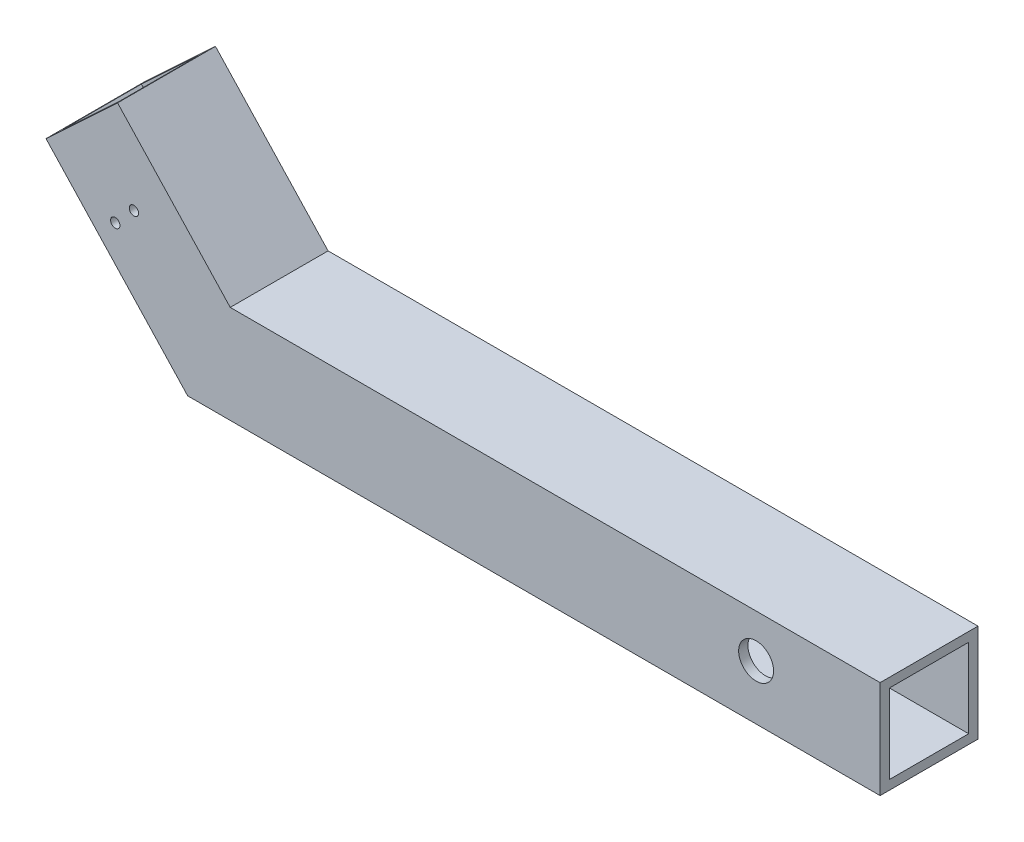
ISO-10303-21;
HEADER;
FILE_DESCRIPTION(('STEP AP214'),'2;1');
FILE_NAME('part.step','',(''),(''),'','','');
FILE_SCHEMA(('AUTOMOTIVE_DESIGN { 1 0 10303 214 1 1 1 1 }'));
ENDSEC;
DATA;
#1=APPLICATION_CONTEXT('core data for automotive mechanical design processes');
#2=APPLICATION_PROTOCOL_DEFINITION('international standard','automotive_design',2000,#1);
#3=PRODUCT_CONTEXT('',#1,'mechanical');
#4=PRODUCT('Part','Part','',(#3));
#5=PRODUCT_RELATED_PRODUCT_CATEGORY('part','',(#4));
#6=PRODUCT_DEFINITION_FORMATION('','',#4);
#7=PRODUCT_DEFINITION_CONTEXT('part definition',#1,'design');
#8=PRODUCT_DEFINITION('design','',#6,#7);
#9=PRODUCT_DEFINITION_SHAPE('','',#8);
#10=(LENGTH_UNIT() NAMED_UNIT(*) SI_UNIT(.MILLI.,.METRE.));
#11=(NAMED_UNIT(*) PLANE_ANGLE_UNIT() SI_UNIT($,.RADIAN.));
#12=(NAMED_UNIT(*) SI_UNIT($,.STERADIAN.) SOLID_ANGLE_UNIT());
#13=UNCERTAINTY_MEASURE_WITH_UNIT(LENGTH_MEASURE(1.E-05),#10,'distance_accuracy_value','');
#14=(GEOMETRIC_REPRESENTATION_CONTEXT(3) GLOBAL_UNCERTAINTY_ASSIGNED_CONTEXT((#13)) GLOBAL_UNIT_ASSIGNED_CONTEXT((#10,
#11,#12)) REPRESENTATION_CONTEXT('',''));
#15=CARTESIAN_POINT('',(0.,0.,0.));
#16=DIRECTION('',(0.,0.,1.));
#17=DIRECTION('',(1.,0.,0.));
#18=AXIS2_PLACEMENT_3D('',#15,#16,#17);
#19=CARTESIAN_POINT('',(-178.186200412297,10.795,10.795));
#20=DIRECTION('',(0.731353701619171,0.681998360062497,0.));
#21=DIRECTION('',(-0.681998360062497,0.731353701619172,0.));
#22=AXIS2_PLACEMENT_3D('',#19,#20,#21);
#23=PLANE('',#22);
#24=DIRECTION('',(-0.681998360062497,0.731353701619171,0.));
#25=VECTOR('',#24,1.);
#26=CARTESIAN_POINT('',(-178.186200412297,10.795,10.795));
#27=LINE('',#26,#25);
#28=CARTESIAN_POINT('',(-178.186200412297,10.795,10.795));
#29=VERTEX_POINT('',#28);
#30=CARTESIAN_POINT('',(-209.630553482196,44.5149403391286,10.795));
#31=VERTEX_POINT('',#30);
#32=EDGE_CURVE('E49',#29,#31,#27,.T.);
#33=ORIENTED_EDGE('',*,*,#32,.T.);
#34=DIRECTION('',(0.,0.,1.));
#35=VECTOR('',#34,1.);
#36=CARTESIAN_POINT('',(-209.630553482196,44.5149403391286,10.795));
#37=LINE('',#36,#35);
#38=CARTESIAN_POINT('',(-209.630553482196,44.5149403391286,-10.795));
#39=VERTEX_POINT('',#38);
#40=EDGE_CURVE('E215',#39,#31,#37,.T.);
#41=ORIENTED_EDGE('',*,*,#40,.F.);
#42=DIRECTION('',(-0.681998360062497,0.731353701619171,0.));
#43=VECTOR('',#42,1.);
#44=CARTESIAN_POINT('',(-178.186200412297,10.795,-10.795));
#45=LINE('',#44,#43);
#46=CARTESIAN_POINT('',(-178.186200412297,10.795,-10.795));
#47=VERTEX_POINT('',#46);
#48=EDGE_CURVE('E190',#47,#39,#45,.T.);
#49=ORIENTED_EDGE('',*,*,#48,.F.);
#50=DIRECTION('',(0.,0.,-1.));
#51=VECTOR('',#50,1.);
#52=CARTESIAN_POINT('',(-178.186200412297,10.795,10.795));
#53=LINE('',#52,#51);
#54=EDGE_CURVE('E173',#29,#47,#53,.T.);
#55=ORIENTED_EDGE('',*,*,#54,.F.);
#56=EDGE_LOOP('',(#33,#41,#49,#55));
#57=FACE_BOUND('',#56,.T.);
#58=ADVANCED_FACE('F34',(#57),#23,.F.);
#59=CARTESIAN_POINT('',(-187.573799587703,-10.795,10.795));
#60=DIRECTION('',(-0.731353701619171,-0.681998360062497,0.));
#61=DIRECTION('',(0.681998360062497,-0.731353701619172,0.));
#62=AXIS2_PLACEMENT_3D('',#59,#60,#61);
#63=PLANE('',#62);
#64=DIRECTION('',(-0.681998360062497,0.731353701619171,0.));
#65=VECTOR('',#64,1.);
#66=CARTESIAN_POINT('',(-187.573799587703,-10.795,-10.795));
#67=LINE('',#66,#65);
#68=CARTESIAN_POINT('',(-187.573799587703,-10.795,-10.795));
#69=VERTEX_POINT('',#68);
#70=CARTESIAN_POINT('',(-225.420479900154,29.7905957453792,-10.795));
#71=VERTEX_POINT('',#70);
#72=EDGE_CURVE('E192',#69,#71,#67,.T.);
#73=ORIENTED_EDGE('',*,*,#72,.T.);
#74=DIRECTION('',(0.,0.,-1.));
#75=VECTOR('',#74,1.);
#76=CARTESIAN_POINT('',(-225.420479900154,29.7905957453792,10.795));
#77=LINE('',#76,#75);
#78=CARTESIAN_POINT('',(-225.420479900154,29.7905957453792,10.795));
#79=VERTEX_POINT('',#78);
#80=EDGE_CURVE('E42',#79,#71,#77,.T.);
#81=ORIENTED_EDGE('',*,*,#80,.F.);
#82=DIRECTION('',(-0.681998360062497,0.731353701619171,0.));
#83=VECTOR('',#82,1.);
#84=CARTESIAN_POINT('',(-187.573799587703,-10.795,10.795));
#85=LINE('',#84,#83);
#86=CARTESIAN_POINT('',(-187.573799587703,-10.795,10.795));
#87=VERTEX_POINT('',#86);
#88=EDGE_CURVE('E56',#87,#79,#85,.T.);
#89=ORIENTED_EDGE('',*,*,#88,.F.);
#90=DIRECTION('',(0.,0.,1.));
#91=VECTOR('',#90,1.);
#92=CARTESIAN_POINT('',(-187.573799587703,-10.795,10.795));
#93=LINE('',#92,#91);
#94=EDGE_CURVE('E229',#69,#87,#93,.T.);
#95=ORIENTED_EDGE('',*,*,#94,.F.);
#96=EDGE_LOOP('',(#73,#81,#89,#95));
#97=FACE_BOUND('',#96,.T.);
#98=ADVANCED_FACE('F225',(#97),#63,.F.);
#99=CARTESIAN_POINT('',(-188.678223020104,-13.335,13.335));
#100=DIRECTION('',(-0.731353701619171,-0.681998360062497,0.));
#101=DIRECTION('',(0.681998360062497,-0.731353701619172,0.));
#102=AXIS2_PLACEMENT_3D('',#99,#100,#101);
#103=PLANE('',#102);
#104=DIRECTION('',(-0.681998360062497,0.731353701619171,0.));
#105=VECTOR('',#104,1.);
#106=CARTESIAN_POINT('',(-188.678223020104,-13.335,13.335));
#107=LINE('',#106,#105);
#108=CARTESIAN_POINT('',(-188.678223020104,-13.335,13.335));
#109=VERTEX_POINT('',#108);
#110=CARTESIAN_POINT('',(-227.278118302266,28.0583199108205,13.335));
#111=VERTEX_POINT('',#110);
#112=EDGE_CURVE('E132',#109,#111,#107,.T.);
#113=ORIENTED_EDGE('',*,*,#112,.T.);
#114=DIRECTION('',(0.,0.,-1.));
#115=VECTOR('',#114,1.);
#116=CARTESIAN_POINT('',(-227.278118302266,28.0583199108205,13.335));
#117=LINE('',#116,#115);
#118=CARTESIAN_POINT('',(-227.278118302266,28.0583199108205,-13.335));
#119=VERTEX_POINT('',#118);
#120=EDGE_CURVE('E209',#111,#119,#117,.T.);
#121=ORIENTED_EDGE('',*,*,#120,.T.);
#122=DIRECTION('',(-0.681998360062497,0.731353701619171,0.));
#123=VECTOR('',#122,1.);
#124=CARTESIAN_POINT('',(-188.678223020104,-13.335,-13.335));
#125=LINE('',#124,#123);
#126=CARTESIAN_POINT('',(-188.678223020104,-13.335,-13.335));
#127=VERTEX_POINT('',#126);
#128=EDGE_CURVE('E198',#127,#119,#125,.T.);
#129=ORIENTED_EDGE('',*,*,#128,.F.);
#130=DIRECTION('',(0.,0.,1.));
#131=VECTOR('',#130,1.);
#132=CARTESIAN_POINT('',(-188.678223020104,-13.335,13.335));
#133=LINE('',#132,#131);
#134=EDGE_CURVE('E157',#127,#109,#133,.T.);
#135=ORIENTED_EDGE('',*,*,#134,.T.);
#136=EDGE_LOOP('',(#113,#121,#129,#135));
#137=FACE_BOUND('',#136,.T.);
#138=ADVANCED_FACE('F238',(#137),#103,.T.);
#139=CARTESIAN_POINT('',(-177.081776979896,13.335,13.335));
#140=DIRECTION('',(0.731353701619171,0.681998360062497,0.));
#141=DIRECTION('',(-0.681998360062497,0.731353701619172,0.));
#142=AXIS2_PLACEMENT_3D('',#139,#140,#141);
#143=PLANE('',#142);
#144=DIRECTION('',(-0.681998360062497,0.731353701619171,0.));
#145=VECTOR('',#144,1.);
#146=CARTESIAN_POINT('',(-177.081776979896,13.335,-13.335));
#147=LINE('',#146,#145);
#148=CARTESIAN_POINT('',(-177.081776979896,13.335,-13.335));
#149=VERTEX_POINT('',#148);
#150=CARTESIAN_POINT('',(-207.772915080083,46.2472161736873,-13.335));
#151=VERTEX_POINT('',#150);
#152=EDGE_CURVE('E200',#149,#151,#147,.T.);
#153=ORIENTED_EDGE('',*,*,#152,.T.);
#154=DIRECTION('',(0.,0.,1.));
#155=VECTOR('',#154,1.);
#156=CARTESIAN_POINT('',(-207.772915080083,46.2472161736873,13.335));
#157=LINE('',#156,#155);
#158=CARTESIAN_POINT('',(-207.772915080083,46.2472161736873,13.335));
#159=VERTEX_POINT('',#158);
#160=EDGE_CURVE('E204',#151,#159,#157,.T.);
#161=ORIENTED_EDGE('',*,*,#160,.T.);
#162=DIRECTION('',(-0.681998360062497,0.731353701619171,0.));
#163=VECTOR('',#162,1.);
#164=CARTESIAN_POINT('',(-177.081776979896,13.335,13.335));
#165=LINE('',#164,#163);
#166=CARTESIAN_POINT('',(-177.081776979896,13.335,13.335));
#167=VERTEX_POINT('',#166);
#168=EDGE_CURVE('E202',#167,#159,#165,.T.);
#169=ORIENTED_EDGE('',*,*,#168,.F.);
#170=DIRECTION('',(0.,0.,-1.));
#171=VECTOR('',#170,1.);
#172=CARTESIAN_POINT('',(-177.081776979896,13.335,13.335));
#173=LINE('',#172,#171);
#174=EDGE_CURVE('E193',#167,#149,#173,.T.);
#175=ORIENTED_EDGE('',*,*,#174,.T.);
#176=EDGE_LOOP('',(#153,#161,#169,#175));
#177=FACE_BOUND('',#176,.T.);
#178=ADVANCED_FACE('F36',(#177),#143,.T.);
#179=CARTESIAN_POINT('',(-171.835765675992,-10.795,-10.795));
#180=DIRECTION('',(0.,0.,-1.));
#181=DIRECTION('',(-1.,0.,0.));
#182=AXIS2_PLACEMENT_3D('',#179,#180,#181);
#183=PLANE('',#182);
#184=CARTESIAN_POINT('',(-208.411861608204,17.6283866894344,-10.795));
#185=DIRECTION('',(0.,0.,-1.));
#186=DIRECTION('',(-1.,0.,0.));
#187=AXIS2_PLACEMENT_3D('',#184,#185,#186);
#188=CIRCLE('',#187,1.26999999999998);
#189=CARTESIAN_POINT('',(-209.681861608204,17.6283866894344,-10.795));
#190=VERTEX_POINT('',#189);
#191=EDGE_CURVE('E280',#190,#190,#188,.T.);
#192=ORIENTED_EDGE('',*,*,#191,.T.);
#193=EDGE_LOOP('',(#192));
#194=FACE_BOUND('',#193,.T.);
#195=CARTESIAN_POINT('',(-203.326149513576,23.0386003588108,-10.795));
#196=DIRECTION('',(0.,0.,-1.));
#197=DIRECTION('',(-1.,0.,0.));
#198=AXIS2_PLACEMENT_3D('',#195,#196,#197);
#199=CIRCLE('',#198,1.27);
#200=CARTESIAN_POINT('',(-204.596149513576,23.0386003588108,-10.795));
#201=VERTEX_POINT('',#200);
#202=EDGE_CURVE('E268',#201,#201,#199,.T.);
#203=ORIENTED_EDGE('',*,*,#202,.T.);
#204=EDGE_LOOP('',(#203));
#205=FACE_BOUND('',#204,.T.);
#206=CARTESIAN_POINT('',(-33.7886153722871,1.55344016562079,-10.795));
#207=DIRECTION('',(0.,0.,-1.));
#208=DIRECTION('',(-1.,0.,0.));
#209=AXIS2_PLACEMENT_3D('',#206,#207,#208);
#210=CIRCLE('',#209,4.7625);
#211=CARTESIAN_POINT('',(-38.5511153722871,1.55344016562079,-10.795));
#212=VERTEX_POINT('',#211);
#213=EDGE_CURVE('E151',#212,#212,#210,.T.);
#214=ORIENTED_EDGE('',*,*,#213,.T.);
#215=EDGE_LOOP('',(#214));
#216=FACE_BOUND('',#215,.T.);
#217=DIRECTION('',(0.,1.,0.));
#218=VECTOR('',#217,1.);
#219=CARTESIAN_POINT('',(0.,-10.795,-10.795));
#220=LINE('',#219,#218);
#221=CARTESIAN_POINT('',(0.,-10.795,-10.795));
#222=VERTEX_POINT('',#221);
#223=CARTESIAN_POINT('',(0.,10.795,-10.795));
#224=VERTEX_POINT('',#223);
#225=EDGE_CURVE('E162',#222,#224,#220,.T.);
#226=ORIENTED_EDGE('',*,*,#225,.T.);
#227=DIRECTION('',(1.,0.,0.));
#228=VECTOR('',#227,1.);
#229=CARTESIAN_POINT('',(-171.835765675992,10.795,-10.795));
#230=LINE('',#229,#228);
#231=EDGE_CURVE('E170',#47,#224,#230,.T.);
#232=ORIENTED_EDGE('',*,*,#231,.F.);
#233=ORIENTED_EDGE('',*,*,#48,.T.);
#234=DIRECTION('',(0.731353701619172,0.681998360062497,0.));
#235=VECTOR('',#234,1.);
#236=CARTESIAN_POINT('',(-221.211513984889,33.7155199584025,-10.795));
#237=LINE('',#236,#235);
#238=EDGE_CURVE('E218',#71,#39,#237,.T.);
#239=ORIENTED_EDGE('',*,*,#238,.F.);
#240=ORIENTED_EDGE('',*,*,#72,.F.);
#241=DIRECTION('',(1.,0.,0.));
#242=VECTOR('',#241,1.);
#243=CARTESIAN_POINT('',(-171.835765675992,-10.795,-10.795));
#244=LINE('',#243,#242);
#245=EDGE_CURVE('E180',#69,#222,#244,.T.);
#246=ORIENTED_EDGE('',*,*,#245,.T.);
#247=EDGE_LOOP('',(#226,#232,#233,#239,#240,#246));
#248=FACE_BOUND('',#247,.T.);
#249=ADVANCED_FACE('F231',(#194,#205,#216,#248),#183,.F.);
#250=CARTESIAN_POINT('',(-171.835765675992,10.795,10.795));
#251=DIRECTION('',(0.,1.,0.));
#252=DIRECTION('',(-1.,0.,0.));
#253=AXIS2_PLACEMENT_3D('',#250,#251,#252);
#254=PLANE('',#253);
#255=DIRECTION('',(0.,0.,1.));
#256=VECTOR('',#255,1.);
#257=CARTESIAN_POINT('',(0.,10.795,10.795));
#258=LINE('',#257,#256);
#259=CARTESIAN_POINT('',(0.,10.795,10.795));
#260=VERTEX_POINT('',#259);
#261=EDGE_CURVE('E137',#224,#260,#258,.T.);
#262=ORIENTED_EDGE('',*,*,#261,.T.);
#263=DIRECTION('',(1.,0.,0.));
#264=VECTOR('',#263,1.);
#265=CARTESIAN_POINT('',(-171.835765675992,10.795,10.795));
#266=LINE('',#265,#264);
#267=EDGE_CURVE('E174',#29,#260,#266,.T.);
#268=ORIENTED_EDGE('',*,*,#267,.F.);
#269=ORIENTED_EDGE('',*,*,#54,.T.);
#270=ORIENTED_EDGE('',*,*,#231,.T.);
#271=EDGE_LOOP('',(#262,#268,#269,#270));
#272=FACE_BOUND('',#271,.T.);
#273=ADVANCED_FACE('F307',(#272),#254,.F.);
#274=CARTESIAN_POINT('',(-171.835765675992,-10.795,10.795));
#275=DIRECTION('',(0.,0.,1.));
#276=DIRECTION('',(1.,0.,0.));
#277=AXIS2_PLACEMENT_3D('',#274,#275,#276);
#278=PLANE('',#277);
#279=CARTESIAN_POINT('',(-208.411861608204,17.6283866894344,10.795));
#280=DIRECTION('',(0.,0.,1.));
#281=DIRECTION('',(1.,0.,0.));
#282=AXIS2_PLACEMENT_3D('',#279,#280,#281);
#283=CIRCLE('',#282,1.26999999999998);
#284=CARTESIAN_POINT('',(-207.141861608204,17.6283866894344,10.795));
#285=VERTEX_POINT('',#284);
#286=EDGE_CURVE('E285',#285,#285,#283,.T.);
#287=ORIENTED_EDGE('',*,*,#286,.T.);
#288=EDGE_LOOP('',(#287));
#289=FACE_BOUND('',#288,.T.);
#290=CARTESIAN_POINT('',(-203.326149513576,23.0386003588108,10.795));
#291=DIRECTION('',(0.,0.,1.));
#292=DIRECTION('',(1.,0.,0.));
#293=AXIS2_PLACEMENT_3D('',#290,#291,#292);
#294=CIRCLE('',#293,1.27);
#295=CARTESIAN_POINT('',(-202.056149513577,23.0386003588108,10.795));
#296=VERTEX_POINT('',#295);
#297=EDGE_CURVE('E273',#296,#296,#294,.T.);
#298=ORIENTED_EDGE('',*,*,#297,.T.);
#299=EDGE_LOOP('',(#298));
#300=FACE_BOUND('',#299,.T.);
#301=CARTESIAN_POINT('',(-33.7886153722871,1.55344016562079,10.795));
#302=DIRECTION('',(0.,0.,1.));
#303=DIRECTION('',(1.,0.,0.));
#304=AXIS2_PLACEMENT_3D('',#301,#302,#303);
#305=CIRCLE('',#304,4.7625);
#306=CARTESIAN_POINT('',(-29.0261153722871,1.55344016562079,10.795));
#307=VERTEX_POINT('',#306);
#308=EDGE_CURVE('E154',#307,#307,#305,.T.);
#309=ORIENTED_EDGE('',*,*,#308,.T.);
#310=EDGE_LOOP('',(#309));
#311=FACE_BOUND('',#310,.T.);
#312=DIRECTION('',(0.,-1.,0.));
#313=VECTOR('',#312,1.);
#314=CARTESIAN_POINT('',(0.,-10.795,10.795));
#315=LINE('',#314,#313);
#316=CARTESIAN_POINT('',(0.,-10.795,10.795));
#317=VERTEX_POINT('',#316);
#318=EDGE_CURVE('E167',#260,#317,#315,.T.);
#319=ORIENTED_EDGE('',*,*,#318,.T.);
#320=DIRECTION('',(1.,0.,0.));
#321=VECTOR('',#320,1.);
#322=CARTESIAN_POINT('',(-171.835765675992,-10.795,10.795));
#323=LINE('',#322,#321);
#324=EDGE_CURVE('E177',#87,#317,#323,.T.);
#325=ORIENTED_EDGE('',*,*,#324,.F.);
#326=ORIENTED_EDGE('',*,*,#88,.T.);
#327=DIRECTION('',(-0.731353701619172,-0.681998360062497,0.));
#328=VECTOR('',#327,1.);
#329=CARTESIAN_POINT('',(-221.211513984889,33.7155199584025,10.795));
#330=LINE('',#329,#328);
#331=EDGE_CURVE('E12',#31,#79,#330,.T.);
#332=ORIENTED_EDGE('',*,*,#331,.F.);
#333=ORIENTED_EDGE('',*,*,#32,.F.);
#334=ORIENTED_EDGE('',*,*,#267,.T.);
#335=EDGE_LOOP('',(#319,#325,#326,#332,#333,#334));
#336=FACE_BOUND('',#335,.T.);
#337=ADVANCED_FACE('F333',(#289,#300,#311,#336),#278,.F.);
#338=CARTESIAN_POINT('',(-171.835765675992,-13.335,13.335));
#339=DIRECTION('',(0.,0.,1.));
#340=DIRECTION('',(1.,0.,0.));
#341=AXIS2_PLACEMENT_3D('',#338,#339,#340);
#342=PLANE('',#341);
#343=CARTESIAN_POINT('',(-208.411861608204,17.6283866894344,13.335));
#344=DIRECTION('',(0.,0.,1.));
#345=DIRECTION('',(1.,0.,0.));
#346=AXIS2_PLACEMENT_3D('',#343,#344,#345);
#347=CIRCLE('',#346,1.26999999999998);
#348=CARTESIAN_POINT('',(-207.141861608204,17.6283866894344,13.335));
#349=VERTEX_POINT('',#348);
#350=EDGE_CURVE('E289',#349,#349,#347,.T.);
#351=ORIENTED_EDGE('',*,*,#350,.F.);
#352=EDGE_LOOP('',(#351));
#353=FACE_BOUND('',#352,.T.);
#354=CARTESIAN_POINT('',(-203.326149513576,23.0386003588108,13.335));
#355=DIRECTION('',(0.,0.,1.));
#356=DIRECTION('',(1.,0.,0.));
#357=AXIS2_PLACEMENT_3D('',#354,#355,#356);
#358=CIRCLE('',#357,1.27);
#359=CARTESIAN_POINT('',(-202.056149513577,23.0386003588108,13.335));
#360=VERTEX_POINT('',#359);
#361=EDGE_CURVE('E277',#360,#360,#358,.T.);
#362=ORIENTED_EDGE('',*,*,#361,.F.);
#363=EDGE_LOOP('',(#362));
#364=FACE_BOUND('',#363,.T.);
#365=CARTESIAN_POINT('',(-33.7886153722871,1.55344016562079,13.335));
#366=DIRECTION('',(0.,0.,1.));
#367=DIRECTION('',(1.,0.,0.));
#368=AXIS2_PLACEMENT_3D('',#365,#366,#367);
#369=CIRCLE('',#368,4.7625);
#370=CARTESIAN_POINT('',(-29.0261153722871,1.55344016562079,13.335));
#371=VERTEX_POINT('',#370);
#372=EDGE_CURVE('E265',#371,#371,#369,.T.);
#373=ORIENTED_EDGE('',*,*,#372,.F.);
#374=EDGE_LOOP('',(#373));
#375=FACE_BOUND('',#374,.T.);
#376=DIRECTION('',(0.,-1.,0.));
#377=VECTOR('',#376,1.);
#378=CARTESIAN_POINT('',(0.,-13.335,13.335));
#379=LINE('',#378,#377);
#380=CARTESIAN_POINT('',(0.,13.335,13.335));
#381=VERTEX_POINT('',#380);
#382=CARTESIAN_POINT('',(0.,-13.335,13.335));
#383=VERTEX_POINT('',#382);
#384=EDGE_CURVE('E129',#381,#383,#379,.T.);
#385=ORIENTED_EDGE('',*,*,#384,.F.);
#386=DIRECTION('',(1.,0.,0.));
#387=VECTOR('',#386,1.);
#388=CARTESIAN_POINT('',(-171.835765675992,13.335,13.335));
#389=LINE('',#388,#387);
#390=EDGE_CURVE('E183',#167,#381,#389,.T.);
#391=ORIENTED_EDGE('',*,*,#390,.F.);
#392=ORIENTED_EDGE('',*,*,#168,.T.);
#393=DIRECTION('',(-0.731353701619172,-0.681998360062497,0.));
#394=VECTOR('',#393,1.);
#395=CARTESIAN_POINT('',(-222.773786357861,32.2586774019506,13.335));
#396=LINE('',#395,#394);
#397=EDGE_CURVE('E207',#159,#111,#396,.T.);
#398=ORIENTED_EDGE('',*,*,#397,.T.);
#399=ORIENTED_EDGE('',*,*,#112,.F.);
#400=DIRECTION('',(1.,0.,0.));
#401=VECTOR('',#400,1.);
#402=CARTESIAN_POINT('',(-171.835765675992,-13.335,13.335));
#403=LINE('',#402,#401);
#404=EDGE_CURVE('E125',#109,#383,#403,.T.);
#405=ORIENTED_EDGE('',*,*,#404,.T.);
#406=EDGE_LOOP('',(#385,#391,#392,#398,#399,#405));
#407=FACE_BOUND('',#406,.T.);
#408=ADVANCED_FACE('F127',(#353,#364,#375,#407),#342,.T.);
#409=CARTESIAN_POINT('',(-171.835765675992,13.335,13.335));
#410=DIRECTION('',(0.,1.,0.));
#411=DIRECTION('',(-1.,0.,0.));
#412=AXIS2_PLACEMENT_3D('',#409,#410,#411);
#413=PLANE('',#412);
#414=DIRECTION('',(0.,0.,1.));
#415=VECTOR('',#414,1.);
#416=CARTESIAN_POINT('',(0.,13.335,13.335));
#417=LINE('',#416,#415);
#418=CARTESIAN_POINT('',(0.,13.335,-13.335));
#419=VERTEX_POINT('',#418);
#420=EDGE_CURVE('E150',#419,#381,#417,.T.);
#421=ORIENTED_EDGE('',*,*,#420,.F.);
#422=DIRECTION('',(1.,0.,0.));
#423=VECTOR('',#422,1.);
#424=CARTESIAN_POINT('',(-171.835765675992,13.335,-13.335));
#425=LINE('',#424,#423);
#426=EDGE_CURVE('E185',#149,#419,#425,.T.);
#427=ORIENTED_EDGE('',*,*,#426,.F.);
#428=ORIENTED_EDGE('',*,*,#174,.F.);
#429=ORIENTED_EDGE('',*,*,#390,.T.);
#430=EDGE_LOOP('',(#421,#427,#428,#429));
#431=FACE_BOUND('',#430,.T.);
#432=ADVANCED_FACE('F340',(#431),#413,.T.);
#433=CARTESIAN_POINT('',(-171.835765675992,-13.335,-13.335));
#434=DIRECTION('',(0.,0.,-1.));
#435=DIRECTION('',(-1.,0.,0.));
#436=AXIS2_PLACEMENT_3D('',#433,#434,#435);
#437=PLANE('',#436);
#438=CARTESIAN_POINT('',(-208.411861608204,17.6283866894344,-13.335));
#439=DIRECTION('',(0.,0.,1.));
#440=DIRECTION('',(1.,0.,0.));
#441=AXIS2_PLACEMENT_3D('',#438,#439,#440);
#442=CIRCLE('',#441,1.26999999999998);
#443=CARTESIAN_POINT('',(-207.141861608204,17.6283866894344,-13.335));
#444=VERTEX_POINT('',#443);
#445=EDGE_CURVE('E288',#444,#444,#442,.T.);
#446=ORIENTED_EDGE('',*,*,#445,.T.);
#447=EDGE_LOOP('',(#446));
#448=FACE_BOUND('',#447,.T.);
#449=CARTESIAN_POINT('',(-203.326149513576,23.0386003588108,-13.335));
#450=DIRECTION('',(0.,0.,1.));
#451=DIRECTION('',(1.,0.,0.));
#452=AXIS2_PLACEMENT_3D('',#449,#450,#451);
#453=CIRCLE('',#452,1.27);
#454=CARTESIAN_POINT('',(-202.056149513577,23.0386003588108,-13.335));
#455=VERTEX_POINT('',#454);
#456=EDGE_CURVE('E276',#455,#455,#453,.T.);
#457=ORIENTED_EDGE('',*,*,#456,.T.);
#458=EDGE_LOOP('',(#457));
#459=FACE_BOUND('',#458,.T.);
#460=CARTESIAN_POINT('',(-33.7886153722871,1.55344016562079,-13.335));
#461=DIRECTION('',(0.,0.,1.));
#462=DIRECTION('',(1.,0.,0.));
#463=AXIS2_PLACEMENT_3D('',#460,#461,#462);
#464=CIRCLE('',#463,4.7625);
#465=CARTESIAN_POINT('',(-29.0261153722871,1.55344016562079,-13.335));
#466=VERTEX_POINT('',#465);
#467=EDGE_CURVE('E264',#466,#466,#464,.T.);
#468=ORIENTED_EDGE('',*,*,#467,.T.);
#469=EDGE_LOOP('',(#468));
#470=FACE_BOUND('',#469,.T.);
#471=DIRECTION('',(0.,1.,0.));
#472=VECTOR('',#471,1.);
#473=CARTESIAN_POINT('',(0.,-13.335,-13.335));
#474=LINE('',#473,#472);
#475=CARTESIAN_POINT('',(0.,-13.335,-13.335));
#476=VERTEX_POINT('',#475);
#477=EDGE_CURVE('E145',#476,#419,#474,.T.);
#478=ORIENTED_EDGE('',*,*,#477,.F.);
#479=DIRECTION('',(1.,0.,0.));
#480=VECTOR('',#479,1.);
#481=CARTESIAN_POINT('',(-171.835765675992,-13.335,-13.335));
#482=LINE('',#481,#480);
#483=EDGE_CURVE('E136',#127,#476,#482,.T.);
#484=ORIENTED_EDGE('',*,*,#483,.F.);
#485=ORIENTED_EDGE('',*,*,#128,.T.);
#486=DIRECTION('',(0.731353701619172,0.681998360062497,0.));
#487=VECTOR('',#486,1.);
#488=CARTESIAN_POINT('',(-222.773786357861,32.2586774019506,-13.335));
#489=LINE('',#488,#487);
#490=EDGE_CURVE('E212',#119,#151,#489,.T.);
#491=ORIENTED_EDGE('',*,*,#490,.T.);
#492=ORIENTED_EDGE('',*,*,#152,.F.);
#493=ORIENTED_EDGE('',*,*,#426,.T.);
#494=EDGE_LOOP('',(#478,#484,#485,#491,#492,#493));
#495=FACE_BOUND('',#494,.T.);
#496=ADVANCED_FACE('F257',(#448,#459,#470,#495),#437,.T.);
#497=CARTESIAN_POINT('',(-171.835765675992,-13.335,13.335));
#498=DIRECTION('',(0.,-1.,0.));
#499=DIRECTION('',(1.,0.,0.));
#500=AXIS2_PLACEMENT_3D('',#497,#498,#499);
#501=PLANE('',#500);
#502=DIRECTION('',(0.,0.,-1.));
#503=VECTOR('',#502,1.);
#504=CARTESIAN_POINT('',(0.,-13.335,13.335));
#505=LINE('',#504,#503);
#506=EDGE_CURVE('E140',#383,#476,#505,.T.);
#507=ORIENTED_EDGE('',*,*,#506,.F.);
#508=ORIENTED_EDGE('',*,*,#404,.F.);
#509=ORIENTED_EDGE('',*,*,#134,.F.);
#510=ORIENTED_EDGE('',*,*,#483,.T.);
#511=EDGE_LOOP('',(#507,#508,#509,#510));
#512=FACE_BOUND('',#511,.T.);
#513=ADVANCED_FACE('F141',(#512),#501,.T.);
#514=CARTESIAN_POINT('',(-171.835765675992,-10.795,10.795));
#515=DIRECTION('',(0.,-1.,0.));
#516=DIRECTION('',(1.,0.,0.));
#517=AXIS2_PLACEMENT_3D('',#514,#515,#516);
#518=PLANE('',#517);
#519=DIRECTION('',(0.,0.,-1.));
#520=VECTOR('',#519,1.);
#521=CARTESIAN_POINT('',(0.,-10.795,10.795));
#522=LINE('',#521,#520);
#523=EDGE_CURVE('E165',#317,#222,#522,.T.);
#524=ORIENTED_EDGE('',*,*,#523,.T.);
#525=ORIENTED_EDGE('',*,*,#245,.F.);
#526=ORIENTED_EDGE('',*,*,#94,.T.);
#527=ORIENTED_EDGE('',*,*,#324,.T.);
#528=EDGE_LOOP('',(#524,#525,#526,#527));
#529=FACE_BOUND('',#528,.T.);
#530=ADVANCED_FACE('F330',(#529),#518,.F.);
#531=CARTESIAN_POINT('',(0.,13.335,13.335));
#532=DIRECTION('',(-1.,0.,0.));
#533=DIRECTION('',(0.,0.,1.));
#534=AXIS2_PLACEMENT_3D('',#531,#532,#533);
#535=PLANE('',#534);
#536=ORIENTED_EDGE('',*,*,#384,.T.);
#537=ORIENTED_EDGE('',*,*,#506,.T.);
#538=ORIENTED_EDGE('',*,*,#477,.T.);
#539=ORIENTED_EDGE('',*,*,#420,.T.);
#540=EDGE_LOOP('',(#536,#537,#538,#539));
#541=FACE_BOUND('',#540,.T.);
#542=ORIENTED_EDGE('',*,*,#225,.F.);
#543=ORIENTED_EDGE('',*,*,#523,.F.);
#544=ORIENTED_EDGE('',*,*,#318,.F.);
#545=ORIENTED_EDGE('',*,*,#261,.F.);
#546=EDGE_LOOP('',(#542,#543,#544,#545));
#547=FACE_BOUND('',#546,.T.);
#548=ADVANCED_FACE('F147',(#541,#547),#535,.F.);
#549=CARTESIAN_POINT('',(-217.525516691175,37.1527680422539,0.));
#550=DIRECTION('',(-0.681998360062497,0.731353701619172,0.));
#551=DIRECTION('',(-0.731353701619172,-0.681998360062497,0.));
#552=AXIS2_PLACEMENT_3D('',#549,#550,#551);
#553=PLANE('',#552);
#554=ORIENTED_EDGE('',*,*,#160,.F.);
#555=ORIENTED_EDGE('',*,*,#490,.F.);
#556=ORIENTED_EDGE('',*,*,#120,.F.);
#557=ORIENTED_EDGE('',*,*,#397,.F.);
#558=EDGE_LOOP('',(#554,#555,#556,#557));
#559=FACE_BOUND('',#558,.T.);
#560=ORIENTED_EDGE('',*,*,#40,.T.);
#561=ORIENTED_EDGE('',*,*,#331,.T.);
#562=ORIENTED_EDGE('',*,*,#80,.T.);
#563=ORIENTED_EDGE('',*,*,#238,.T.);
#564=EDGE_LOOP('',(#560,#561,#562,#563));
#565=FACE_BOUND('',#564,.T.);
#566=ADVANCED_FACE('F222',(#559,#565),#553,.T.);
#567=CARTESIAN_POINT('',(-33.7886153722871,1.55344016562079,-13.335));
#568=DIRECTION('',(0.,0.,1.));
#569=DIRECTION('',(1.,0.,0.));
#570=AXIS2_PLACEMENT_3D('',#567,#568,#569);
#571=CYLINDRICAL_SURFACE('',#570,4.7625);
#572=ORIENTED_EDGE('',*,*,#467,.F.);
#573=EDGE_LOOP('',(#572));
#574=FACE_BOUND('',#573,.T.);
#575=ORIENTED_EDGE('',*,*,#213,.F.);
#576=EDGE_LOOP('',(#575));
#577=FACE_BOUND('',#576,.T.);
#578=ADVANCED_FACE('F313',(#574,#577),#571,.F.);
#579=ORIENTED_EDGE('',*,*,#372,.T.);
#580=EDGE_LOOP('',(#579));
#581=FACE_BOUND('',#580,.T.);
#582=ORIENTED_EDGE('',*,*,#308,.F.);
#583=EDGE_LOOP('',(#582));
#584=FACE_BOUND('',#583,.T.);
#585=ADVANCED_FACE('F315',(#581,#584),#571,.F.);
#586=CARTESIAN_POINT('',(-203.326149513576,23.0386003588108,-13.335));
#587=DIRECTION('',(0.,0.,1.));
#588=DIRECTION('',(1.,0.,0.));
#589=AXIS2_PLACEMENT_3D('',#586,#587,#588);
#590=CYLINDRICAL_SURFACE('',#589,1.27);
#591=ORIENTED_EDGE('',*,*,#456,.F.);
#592=EDGE_LOOP('',(#591));
#593=FACE_BOUND('',#592,.T.);
#594=ORIENTED_EDGE('',*,*,#202,.F.);
#595=EDGE_LOOP('',(#594));
#596=FACE_BOUND('',#595,.T.);
#597=ADVANCED_FACE('F322',(#593,#596),#590,.F.);
#598=ORIENTED_EDGE('',*,*,#361,.T.);
#599=EDGE_LOOP('',(#598));
#600=FACE_BOUND('',#599,.T.);
#601=ORIENTED_EDGE('',*,*,#297,.F.);
#602=EDGE_LOOP('',(#601));
#603=FACE_BOUND('',#602,.T.);
#604=ADVANCED_FACE('F301',(#600,#603),#590,.F.);
#605=CARTESIAN_POINT('',(-208.411861608204,17.6283866894344,-13.335));
#606=DIRECTION('',(0.,0.,1.));
#607=DIRECTION('',(1.,0.,0.));
#608=AXIS2_PLACEMENT_3D('',#605,#606,#607);
#609=CYLINDRICAL_SURFACE('',#608,1.26999999999998);
#610=ORIENTED_EDGE('',*,*,#445,.F.);
#611=EDGE_LOOP('',(#610));
#612=FACE_BOUND('',#611,.T.);
#613=ORIENTED_EDGE('',*,*,#191,.F.);
#614=EDGE_LOOP('',(#613));
#615=FACE_BOUND('',#614,.T.);
#616=ADVANCED_FACE('F297',(#612,#615),#609,.F.);
#617=ORIENTED_EDGE('',*,*,#350,.T.);
#618=EDGE_LOOP('',(#617));
#619=FACE_BOUND('',#618,.T.);
#620=ORIENTED_EDGE('',*,*,#286,.F.);
#621=EDGE_LOOP('',(#620));
#622=FACE_BOUND('',#621,.T.);
#623=ADVANCED_FACE('F300',(#619,#622),#609,.F.);
#624=CLOSED_SHELL('',(#58,#98,#138,#178,#249,#273,#337,#408,#432,#496,#513,#530,#548,#566,#578,
#585,#597,#604,#616,#623));
#625=MANIFOLD_SOLID_BREP('B2',#624);
#626=ADVANCED_BREP_SHAPE_REPRESENTATION('',(#18,#625),#14);
#627=SHAPE_DEFINITION_REPRESENTATION(#9,#626);
ENDSEC;
END-ISO-10303-21;
